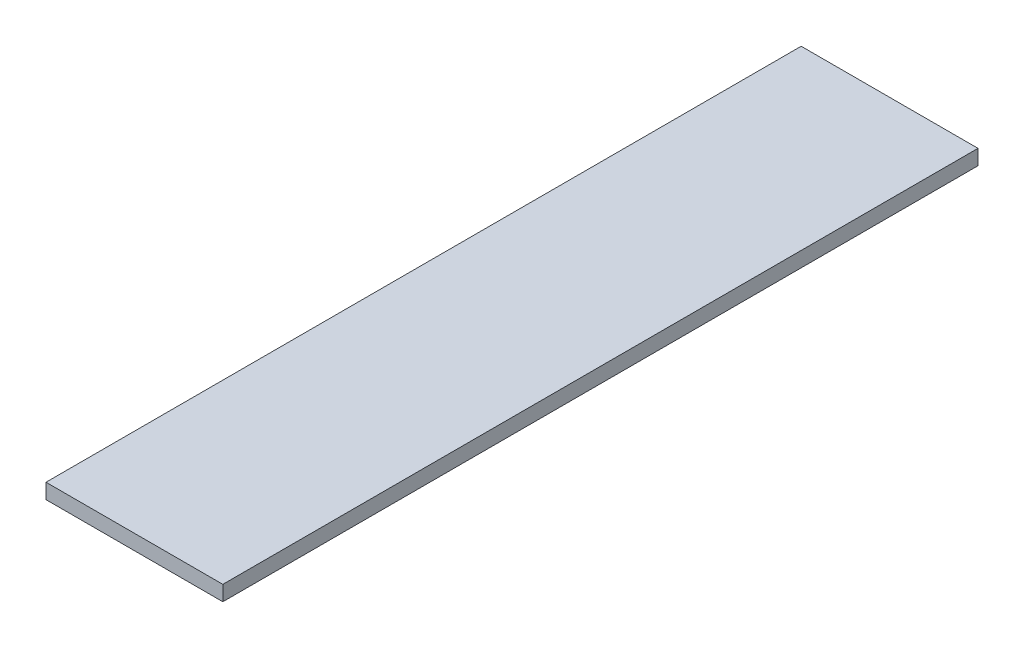
ISO-10303-21;
HEADER;
FILE_DESCRIPTION(('STEP AP214'),'2;1');
FILE_NAME('part.step','',(''),(''),'','','');
FILE_SCHEMA(('AUTOMOTIVE_DESIGN { 1 0 10303 214 1 1 1 1 }'));
ENDSEC;
DATA;
#1=APPLICATION_CONTEXT('core data for automotive mechanical design processes');
#2=APPLICATION_PROTOCOL_DEFINITION('international standard','automotive_design',2000,#1);
#3=PRODUCT_CONTEXT('',#1,'mechanical');
#4=PRODUCT('Part','Part','',(#3));
#5=PRODUCT_RELATED_PRODUCT_CATEGORY('part','',(#4));
#6=PRODUCT_DEFINITION_FORMATION('','',#4);
#7=PRODUCT_DEFINITION_CONTEXT('part definition',#1,'design');
#8=PRODUCT_DEFINITION('design','',#6,#7);
#9=PRODUCT_DEFINITION_SHAPE('','',#8);
#10=(LENGTH_UNIT() NAMED_UNIT(*) SI_UNIT(.MILLI.,.METRE.));
#11=(NAMED_UNIT(*) PLANE_ANGLE_UNIT() SI_UNIT($,.RADIAN.));
#12=(NAMED_UNIT(*) SI_UNIT($,.STERADIAN.) SOLID_ANGLE_UNIT());
#13=UNCERTAINTY_MEASURE_WITH_UNIT(LENGTH_MEASURE(1.E-05),#10,'distance_accuracy_value','');
#14=(GEOMETRIC_REPRESENTATION_CONTEXT(3) GLOBAL_UNCERTAINTY_ASSIGNED_CONTEXT((#13)) GLOBAL_UNIT_ASSIGNED_CONTEXT((#10,
#11,#12)) REPRESENTATION_CONTEXT('',''));
#15=CARTESIAN_POINT('',(0.,0.,0.));
#16=DIRECTION('',(0.,0.,1.));
#17=DIRECTION('',(1.,0.,0.));
#18=AXIS2_PLACEMENT_3D('',#15,#16,#17);
#19=CARTESIAN_POINT('',(5.85415654241579,-1.2694178482715E-12,25.));
#20=DIRECTION('',(1.,-2.16840434497104E-13,0.));
#21=DIRECTION('',(2.16840434497104E-13,1.,0.));
#22=AXIS2_PLACEMENT_3D('',#19,#20,#21);
#23=PLANE('',#22);
#24=DIRECTION('',(-2.16840434497104E-13,-1.,0.));
#25=VECTOR('',#24,1.);
#26=CARTESIAN_POINT('',(5.85415654241579,-1.2694178482715E-12,-25.));
#27=LINE('',#26,#25);
#28=CARTESIAN_POINT('',(5.85415654242809,56.6985789167307,-25.));
#29=VERTEX_POINT('',#28);
#30=CARTESIAN_POINT('',(5.85415654242787,55.6985789167308,-25.));
#31=VERTEX_POINT('',#30);
#32=EDGE_CURVE('E107',#29,#31,#27,.T.);
#33=ORIENTED_EDGE('',*,*,#32,.F.);
#34=DIRECTION('',(0.,0.,-1.));
#35=VECTOR('',#34,1.);
#36=CARTESIAN_POINT('',(5.85415654242809,56.6985789167307,25.));
#37=LINE('',#36,#35);
#38=CARTESIAN_POINT('',(5.85415654242809,56.6985789167307,25.));
#39=VERTEX_POINT('',#38);
#40=EDGE_CURVE('E11',#39,#29,#37,.T.);
#41=ORIENTED_EDGE('',*,*,#40,.F.);
#42=DIRECTION('',(-2.16840434497104E-13,-1.,0.));
#43=VECTOR('',#42,1.);
#44=CARTESIAN_POINT('',(5.85415654241579,-1.2694178482715E-12,25.));
#45=LINE('',#44,#43);
#46=CARTESIAN_POINT('',(5.85415654242787,55.6985789167308,25.));
#47=VERTEX_POINT('',#46);
#48=EDGE_CURVE('E96',#39,#47,#45,.T.);
#49=ORIENTED_EDGE('',*,*,#48,.T.);
#50=DIRECTION('',(0.,0.,-1.));
#51=VECTOR('',#50,1.);
#52=CARTESIAN_POINT('',(5.85415654242787,55.6985789167308,25.));
#53=LINE('',#52,#51);
#54=EDGE_CURVE('E56',#47,#31,#53,.T.);
#55=ORIENTED_EDGE('',*,*,#54,.T.);
#56=EDGE_LOOP('',(#33,#41,#49,#55));
#57=FACE_BOUND('',#56,.T.);
#58=ADVANCED_FACE('F39',(#57),#23,.T.);
#59=CARTESIAN_POINT('',(0.,56.6985789167308,25.));
#60=DIRECTION('',(0.,1.,0.));
#61=DIRECTION('',(-1.,0.,0.));
#62=AXIS2_PLACEMENT_3D('',#59,#60,#61);
#63=PLANE('',#62);
#64=DIRECTION('',(1.,0.,0.));
#65=VECTOR('',#64,1.);
#66=CARTESIAN_POINT('',(0.,56.6985789167308,-25.));
#67=LINE('',#66,#65);
#68=CARTESIAN_POINT('',(-5.85415654242803,56.6985789167308,-25.));
#69=VERTEX_POINT('',#68);
#70=EDGE_CURVE('E86',#69,#29,#67,.T.);
#71=ORIENTED_EDGE('',*,*,#70,.F.);
#72=DIRECTION('',(0.,0.,-1.));
#73=VECTOR('',#72,1.);
#74=CARTESIAN_POINT('',(-5.85415654242803,56.6985789167308,25.));
#75=LINE('',#74,#73);
#76=CARTESIAN_POINT('',(-5.85415654242803,56.6985789167308,25.));
#77=VERTEX_POINT('',#76);
#78=EDGE_CURVE('E48',#77,#69,#75,.T.);
#79=ORIENTED_EDGE('',*,*,#78,.F.);
#80=DIRECTION('',(1.,0.,0.));
#81=VECTOR('',#80,1.);
#82=CARTESIAN_POINT('',(0.,56.6985789167308,25.));
#83=LINE('',#82,#81);
#84=EDGE_CURVE('E84',#77,#39,#83,.T.);
#85=ORIENTED_EDGE('',*,*,#84,.T.);
#86=ORIENTED_EDGE('',*,*,#40,.T.);
#87=EDGE_LOOP('',(#71,#79,#85,#86));
#88=FACE_BOUND('',#87,.T.);
#89=ADVANCED_FACE('F83',(#88),#63,.T.);
#90=CARTESIAN_POINT('',(-5.85415654242803,0.,25.));
#91=DIRECTION('',(-1.,0.,0.));
#92=DIRECTION('',(0.,0.,1.));
#93=AXIS2_PLACEMENT_3D('',#90,#91,#92);
#94=PLANE('',#93);
#95=DIRECTION('',(0.,1.,0.));
#96=VECTOR('',#95,1.);
#97=CARTESIAN_POINT('',(-5.85415654242803,0.,-25.));
#98=LINE('',#97,#96);
#99=CARTESIAN_POINT('',(-5.85415654242803,55.6985789167308,-25.));
#100=VERTEX_POINT('',#99);
#101=EDGE_CURVE('E112',#100,#69,#98,.T.);
#102=ORIENTED_EDGE('',*,*,#101,.F.);
#103=DIRECTION('',(0.,0.,-1.));
#104=VECTOR('',#103,1.);
#105=CARTESIAN_POINT('',(-5.85415654242803,55.6985789167308,25.));
#106=LINE('',#105,#104);
#107=CARTESIAN_POINT('',(-5.85415654242803,55.6985789167308,25.));
#108=VERTEX_POINT('',#107);
#109=EDGE_CURVE('E69',#108,#100,#106,.T.);
#110=ORIENTED_EDGE('',*,*,#109,.F.);
#111=DIRECTION('',(0.,1.,0.));
#112=VECTOR('',#111,1.);
#113=CARTESIAN_POINT('',(-5.85415654242803,0.,25.));
#114=LINE('',#113,#112);
#115=EDGE_CURVE('E95',#108,#77,#114,.T.);
#116=ORIENTED_EDGE('',*,*,#115,.T.);
#117=ORIENTED_EDGE('',*,*,#78,.T.);
#118=EDGE_LOOP('',(#102,#110,#116,#117));
#119=FACE_BOUND('',#118,.T.);
#120=ADVANCED_FACE('F99',(#119),#94,.T.);
#121=CARTESIAN_POINT('',(0.,55.6985789167308,25.));
#122=DIRECTION('',(0.,-1.,0.));
#123=DIRECTION('',(0.,0.,-1.));
#124=AXIS2_PLACEMENT_3D('',#121,#122,#123);
#125=PLANE('',#124);
#126=DIRECTION('',(-1.,0.,0.));
#127=VECTOR('',#126,1.);
#128=CARTESIAN_POINT('',(0.,55.6985789167308,-25.));
#129=LINE('',#128,#127);
#130=EDGE_CURVE('E115',#31,#100,#129,.T.);
#131=ORIENTED_EDGE('',*,*,#130,.F.);
#132=ORIENTED_EDGE('',*,*,#54,.F.);
#133=DIRECTION('',(-1.,0.,0.));
#134=VECTOR('',#133,1.);
#135=CARTESIAN_POINT('',(0.,55.6985789167308,25.));
#136=LINE('',#135,#134);
#137=EDGE_CURVE('E101',#47,#108,#136,.T.);
#138=ORIENTED_EDGE('',*,*,#137,.T.);
#139=ORIENTED_EDGE('',*,*,#109,.T.);
#140=EDGE_LOOP('',(#131,#132,#138,#139));
#141=FACE_BOUND('',#140,.T.);
#142=ADVANCED_FACE('F124',(#141),#125,.T.);
#143=CARTESIAN_POINT('',(0.,0.,25.));
#144=DIRECTION('',(0.,0.,1.));
#145=DIRECTION('',(1.,0.,0.));
#146=AXIS2_PLACEMENT_3D('',#143,#144,#145);
#147=PLANE('',#146);
#148=ORIENTED_EDGE('',*,*,#48,.F.);
#149=ORIENTED_EDGE('',*,*,#84,.F.);
#150=ORIENTED_EDGE('',*,*,#115,.F.);
#151=ORIENTED_EDGE('',*,*,#137,.F.);
#152=EDGE_LOOP('',(#148,#149,#150,#151));
#153=FACE_BOUND('',#152,.T.);
#154=ADVANCED_FACE('F93',(#153),#147,.T.);
#155=CARTESIAN_POINT('',(0.,0.,-25.));
#156=DIRECTION('',(0.,0.,1.));
#157=DIRECTION('',(1.,0.,0.));
#158=AXIS2_PLACEMENT_3D('',#155,#156,#157);
#159=PLANE('',#158);
#160=ORIENTED_EDGE('',*,*,#32,.T.);
#161=ORIENTED_EDGE('',*,*,#130,.T.);
#162=ORIENTED_EDGE('',*,*,#101,.T.);
#163=ORIENTED_EDGE('',*,*,#70,.T.);
#164=EDGE_LOOP('',(#160,#161,#162,#163));
#165=FACE_BOUND('',#164,.T.);
#166=ADVANCED_FACE('F131',(#165),#159,.F.);
#167=CLOSED_SHELL('',(#58,#89,#120,#142,#154,#166));
#168=MANIFOLD_SOLID_BREP('B2',#167);
#169=ADVANCED_BREP_SHAPE_REPRESENTATION('',(#18,#168),#14);
#170=SHAPE_DEFINITION_REPRESENTATION(#9,#169);
ENDSEC;
END-ISO-10303-21;
